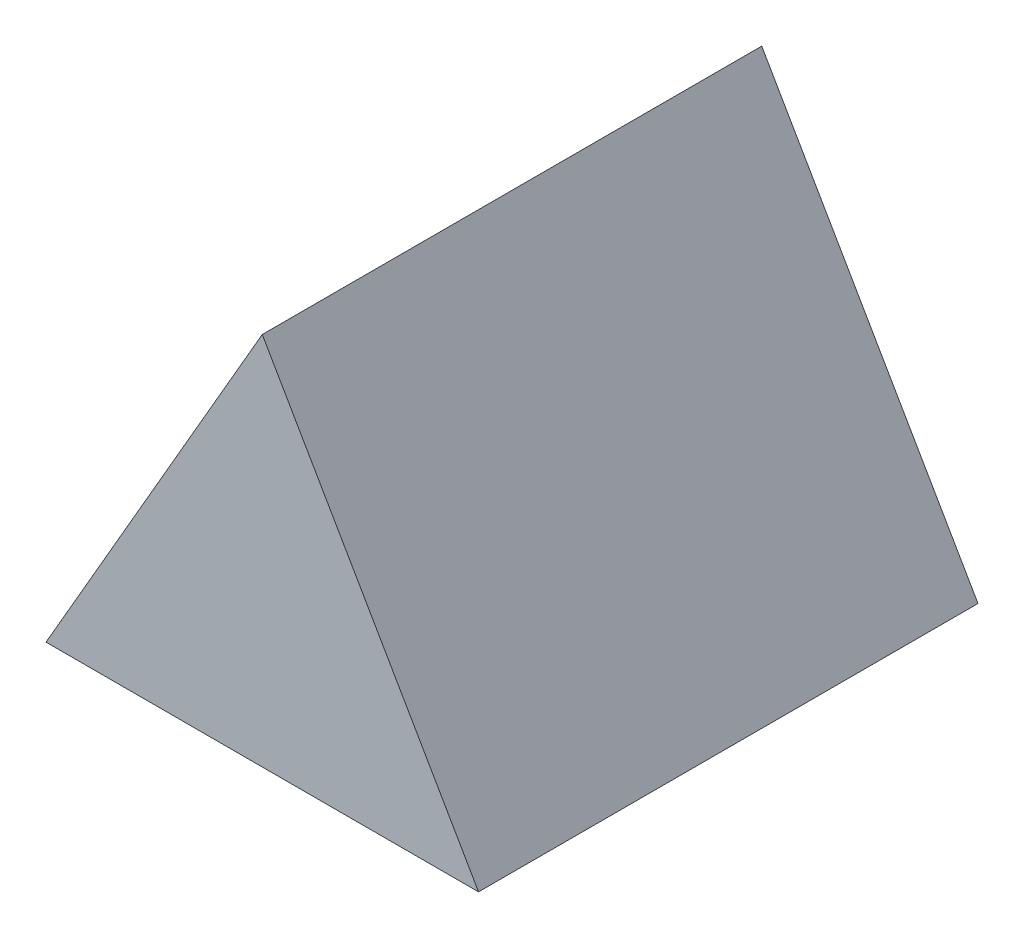
ISO-10303-21;
HEADER;
FILE_DESCRIPTION(('STEP AP214'),'2;1');
FILE_NAME('part.step','',(''),(''),'','','');
FILE_SCHEMA(('AUTOMOTIVE_DESIGN { 1 0 10303 214 1 1 1 1 }'));
ENDSEC;
DATA;
#1=APPLICATION_CONTEXT('core data for automotive mechanical design processes');
#2=APPLICATION_PROTOCOL_DEFINITION('international standard','automotive_design',2000,#1);
#3=PRODUCT_CONTEXT('',#1,'mechanical');
#4=PRODUCT('Part','Part','',(#3));
#5=PRODUCT_RELATED_PRODUCT_CATEGORY('part','',(#4));
#6=PRODUCT_DEFINITION_FORMATION('','',#4);
#7=PRODUCT_DEFINITION_CONTEXT('part definition',#1,'design');
#8=PRODUCT_DEFINITION('design','',#6,#7);
#9=PRODUCT_DEFINITION_SHAPE('','',#8);
#10=(LENGTH_UNIT() NAMED_UNIT(*) SI_UNIT(.MILLI.,.METRE.));
#11=(NAMED_UNIT(*) PLANE_ANGLE_UNIT() SI_UNIT($,.RADIAN.));
#12=(NAMED_UNIT(*) SI_UNIT($,.STERADIAN.) SOLID_ANGLE_UNIT());
#13=UNCERTAINTY_MEASURE_WITH_UNIT(LENGTH_MEASURE(1.E-05),#10,'distance_accuracy_value','');
#14=(GEOMETRIC_REPRESENTATION_CONTEXT(3) GLOBAL_UNCERTAINTY_ASSIGNED_CONTEXT((#13)) GLOBAL_UNIT_ASSIGNED_CONTEXT((#10,
#11,#12)) REPRESENTATION_CONTEXT('',''));
#15=CARTESIAN_POINT('',(0.,0.,0.));
#16=DIRECTION('',(0.,0.,1.));
#17=DIRECTION('',(1.,0.,0.));
#18=AXIS2_PLACEMENT_3D('',#15,#16,#17);
#19=CARTESIAN_POINT('',(25.9807621135332,-15.,60.));
#20=DIRECTION('',(-0.866025403784439,-0.5,0.));
#21=DIRECTION('',(0.5,-0.866025403784439,0.));
#22=AXIS2_PLACEMENT_3D('',#19,#20,#21);
#23=PLANE('',#22);
#24=DIRECTION('',(-0.5,0.866025403784439,0.));
#25=VECTOR('',#24,1.);
#26=CARTESIAN_POINT('',(25.9807621135332,-15.,0.));
#27=LINE('',#26,#25);
#28=CARTESIAN_POINT('',(25.9807621135332,-15.,0.));
#29=VERTEX_POINT('',#28);
#30=CARTESIAN_POINT('',(0.,30.,0.));
#31=VERTEX_POINT('',#30);
#32=EDGE_CURVE('E86',#29,#31,#27,.T.);
#33=ORIENTED_EDGE('',*,*,#32,.T.);
#34=DIRECTION('',(0.,0.,-1.));
#35=VECTOR('',#34,1.);
#36=CARTESIAN_POINT('',(0.,30.,60.));
#37=LINE('',#36,#35);
#38=CARTESIAN_POINT('',(0.,30.,60.));
#39=VERTEX_POINT('',#38);
#40=EDGE_CURVE('E11',#39,#31,#37,.T.);
#41=ORIENTED_EDGE('',*,*,#40,.F.);
#42=DIRECTION('',(-0.5,0.866025403784439,0.));
#43=VECTOR('',#42,1.);
#44=CARTESIAN_POINT('',(25.9807621135332,-15.,60.));
#45=LINE('',#44,#43);
#46=CARTESIAN_POINT('',(25.9807621135332,-15.,60.));
#47=VERTEX_POINT('',#46);
#48=EDGE_CURVE('E80',#47,#39,#45,.T.);
#49=ORIENTED_EDGE('',*,*,#48,.F.);
#50=DIRECTION('',(0.,0.,-1.));
#51=VECTOR('',#50,1.);
#52=CARTESIAN_POINT('',(25.9807621135332,-15.,60.));
#53=LINE('',#52,#51);
#54=EDGE_CURVE('E90',#47,#29,#53,.T.);
#55=ORIENTED_EDGE('',*,*,#54,.T.);
#56=EDGE_LOOP('',(#33,#41,#49,#55));
#57=FACE_BOUND('',#56,.T.);
#58=ADVANCED_FACE('F39',(#57),#23,.F.);
#59=CARTESIAN_POINT('',(0.,30.,60.));
#60=DIRECTION('',(0.866025403784439,-0.5,0.));
#61=DIRECTION('',(0.5,0.866025403784439,0.));
#62=AXIS2_PLACEMENT_3D('',#59,#60,#61);
#63=PLANE('',#62);
#64=DIRECTION('',(-0.5,-0.866025403784439,0.));
#65=VECTOR('',#64,1.);
#66=CARTESIAN_POINT('',(0.,30.,0.));
#67=LINE('',#66,#65);
#68=CARTESIAN_POINT('',(-25.9807621135332,-15.,0.));
#69=VERTEX_POINT('',#68);
#70=EDGE_CURVE('E70',#31,#69,#67,.T.);
#71=ORIENTED_EDGE('',*,*,#70,.T.);
#72=DIRECTION('',(0.,0.,-1.));
#73=VECTOR('',#72,1.);
#74=CARTESIAN_POINT('',(-25.9807621135332,-15.,60.));
#75=LINE('',#74,#73);
#76=CARTESIAN_POINT('',(-25.9807621135332,-15.,60.));
#77=VERTEX_POINT('',#76);
#78=EDGE_CURVE('E50',#77,#69,#75,.T.);
#79=ORIENTED_EDGE('',*,*,#78,.F.);
#80=DIRECTION('',(-0.5,-0.866025403784439,0.));
#81=VECTOR('',#80,1.);
#82=CARTESIAN_POINT('',(0.,30.,60.));
#83=LINE('',#82,#81);
#84=EDGE_CURVE('E73',#39,#77,#83,.T.);
#85=ORIENTED_EDGE('',*,*,#84,.F.);
#86=ORIENTED_EDGE('',*,*,#40,.T.);
#87=EDGE_LOOP('',(#71,#79,#85,#86));
#88=FACE_BOUND('',#87,.T.);
#89=ADVANCED_FACE('F78',(#88),#63,.F.);
#90=CARTESIAN_POINT('',(-25.9807621135332,-15.,60.));
#91=DIRECTION('',(0.,1.,0.));
#92=DIRECTION('',(-1.,0.,0.));
#93=AXIS2_PLACEMENT_3D('',#90,#91,#92);
#94=PLANE('',#93);
#95=DIRECTION('',(1.,0.,0.));
#96=VECTOR('',#95,1.);
#97=CARTESIAN_POINT('',(-25.9807621135332,-15.,0.));
#98=LINE('',#97,#96);
#99=EDGE_CURVE('E74',#69,#29,#98,.T.);
#100=ORIENTED_EDGE('',*,*,#99,.T.);
#101=ORIENTED_EDGE('',*,*,#54,.F.);
#102=DIRECTION('',(1.,0.,0.));
#103=VECTOR('',#102,1.);
#104=CARTESIAN_POINT('',(-25.9807621135332,-15.,60.));
#105=LINE('',#104,#103);
#106=EDGE_CURVE('E54',#77,#47,#105,.T.);
#107=ORIENTED_EDGE('',*,*,#106,.F.);
#108=ORIENTED_EDGE('',*,*,#78,.T.);
#109=EDGE_LOOP('',(#100,#101,#107,#108));
#110=FACE_BOUND('',#109,.T.);
#111=ADVANCED_FACE('F92',(#110),#94,.F.);
#112=CARTESIAN_POINT('',(0.,0.,60.));
#113=DIRECTION('',(0.,0.,1.));
#114=DIRECTION('',(1.,0.,0.));
#115=AXIS2_PLACEMENT_3D('',#112,#113,#114);
#116=PLANE('',#115);
#117=ORIENTED_EDGE('',*,*,#48,.T.);
#118=ORIENTED_EDGE('',*,*,#84,.T.);
#119=ORIENTED_EDGE('',*,*,#106,.T.);
#120=EDGE_LOOP('',(#117,#118,#119));
#121=FACE_BOUND('',#120,.T.);
#122=ADVANCED_FACE('F85',(#121),#116,.T.);
#123=CARTESIAN_POINT('',(0.,0.,0.));
#124=DIRECTION('',(0.,0.,1.));
#125=DIRECTION('',(1.,0.,0.));
#126=AXIS2_PLACEMENT_3D('',#123,#124,#125);
#127=PLANE('',#126);
#128=ORIENTED_EDGE('',*,*,#32,.F.);
#129=ORIENTED_EDGE('',*,*,#99,.F.);
#130=ORIENTED_EDGE('',*,*,#70,.F.);
#131=EDGE_LOOP('',(#128,#129,#130));
#132=FACE_BOUND('',#131,.T.);
#133=ADVANCED_FACE('F94',(#132),#127,.F.);
#134=CLOSED_SHELL('',(#58,#89,#111,#122,#133));
#135=MANIFOLD_SOLID_BREP('B2',#134);
#136=ADVANCED_BREP_SHAPE_REPRESENTATION('',(#18,#135),#14);
#137=SHAPE_DEFINITION_REPRESENTATION(#9,#136);
ENDSEC;
END-ISO-10303-21;
